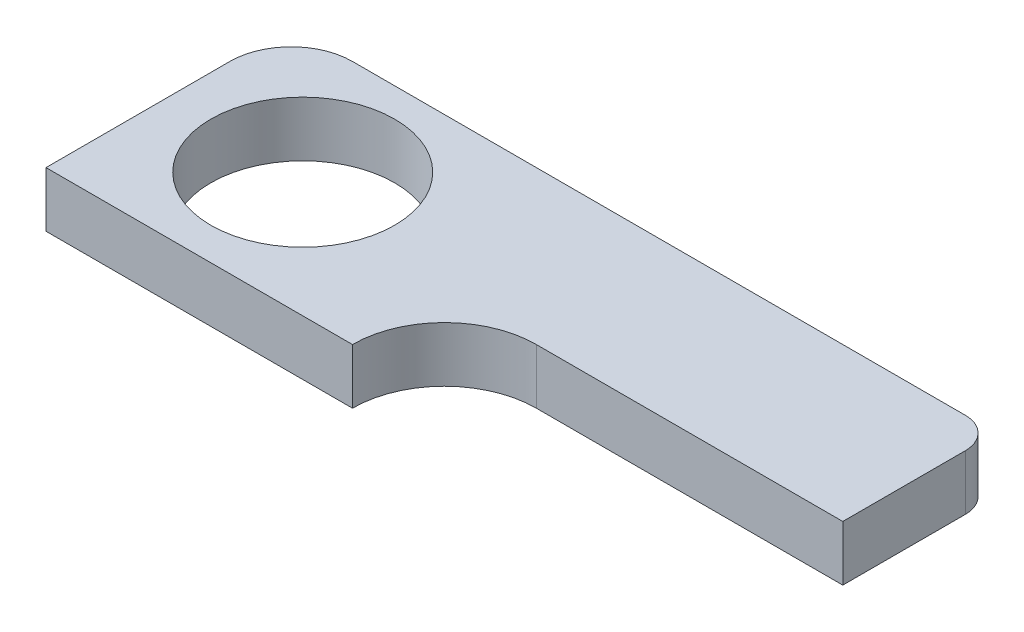
ISO-10303-21;
HEADER;
FILE_DESCRIPTION(('STEP AP214'),'2;1');
FILE_NAME('part.step','',(''),(''),'','','');
FILE_SCHEMA(('AUTOMOTIVE_DESIGN { 1 0 10303 214 1 1 1 1 }'));
ENDSEC;
DATA;
#1=APPLICATION_CONTEXT('core data for automotive mechanical design processes');
#2=APPLICATION_PROTOCOL_DEFINITION('international standard','automotive_design',2000,#1);
#3=PRODUCT_CONTEXT('',#1,'mechanical');
#4=PRODUCT('Part','Part','',(#3));
#5=PRODUCT_RELATED_PRODUCT_CATEGORY('part','',(#4));
#6=PRODUCT_DEFINITION_FORMATION('','',#4);
#7=PRODUCT_DEFINITION_CONTEXT('part definition',#1,'design');
#8=PRODUCT_DEFINITION('design','',#6,#7);
#9=PRODUCT_DEFINITION_SHAPE('','',#8);
#10=(LENGTH_UNIT() NAMED_UNIT(*) SI_UNIT(.MILLI.,.METRE.));
#11=(NAMED_UNIT(*) PLANE_ANGLE_UNIT() SI_UNIT($,.RADIAN.));
#12=(NAMED_UNIT(*) SI_UNIT($,.STERADIAN.) SOLID_ANGLE_UNIT());
#13=UNCERTAINTY_MEASURE_WITH_UNIT(LENGTH_MEASURE(1.E-05),#10,'distance_accuracy_value','');
#14=(GEOMETRIC_REPRESENTATION_CONTEXT(3) GLOBAL_UNCERTAINTY_ASSIGNED_CONTEXT((#13)) GLOBAL_UNIT_ASSIGNED_CONTEXT((#10,
#11,#12)) REPRESENTATION_CONTEXT('',''));
#15=CARTESIAN_POINT('',(0.,0.,0.));
#16=DIRECTION('',(0.,0.,1.));
#17=DIRECTION('',(1.,0.,0.));
#18=AXIS2_PLACEMENT_3D('',#15,#16,#17);
#19=CARTESIAN_POINT('',(230.,18.,-90.));
#20=DIRECTION('',(1.,0.,0.));
#21=DIRECTION('',(0.,0.,-1.));
#22=AXIS2_PLACEMENT_3D('',#19,#20,#21);
#23=PLANE('',#22);
#24=DIRECTION('',(0.,0.,1.));
#25=VECTOR('',#24,1.);
#26=CARTESIAN_POINT('',(230.,0.,-90.));
#27=LINE('',#26,#25);
#28=CARTESIAN_POINT('',(230.,0.,-90.));
#29=VERTEX_POINT('',#28);
#30=CARTESIAN_POINT('',(230.,0.,-50.));
#31=VERTEX_POINT('',#30);
#32=EDGE_CURVE('E130',#29,#31,#27,.T.);
#33=ORIENTED_EDGE('',*,*,#32,.F.);
#34=DIRECTION('',(0.,-1.,0.));
#35=VECTOR('',#34,1.);
#36=CARTESIAN_POINT('',(230.,18.,-90.));
#37=LINE('',#36,#35);
#38=CARTESIAN_POINT('',(230.,18.,-90.));
#39=VERTEX_POINT('',#38);
#40=EDGE_CURVE('E11',#39,#29,#37,.T.);
#41=ORIENTED_EDGE('',*,*,#40,.F.);
#42=DIRECTION('',(0.,0.,1.));
#43=VECTOR('',#42,1.);
#44=CARTESIAN_POINT('',(230.,18.,-90.));
#45=LINE('',#44,#43);
#46=CARTESIAN_POINT('',(230.,18.,-50.));
#47=VERTEX_POINT('',#46);
#48=EDGE_CURVE('E151',#39,#47,#45,.T.);
#49=ORIENTED_EDGE('',*,*,#48,.T.);
#50=DIRECTION('',(0.,-1.,0.));
#51=VECTOR('',#50,1.);
#52=CARTESIAN_POINT('',(230.,18.,-50.));
#53=LINE('',#52,#51);
#54=EDGE_CURVE('E36',#47,#31,#53,.T.);
#55=ORIENTED_EDGE('',*,*,#54,.T.);
#56=EDGE_LOOP('',(#33,#41,#49,#55));
#57=FACE_BOUND('',#56,.T.);
#58=ADVANCED_FACE('F33',(#57),#23,.T.);
#59=CARTESIAN_POINT('',(220.,18.,-90.));
#60=DIRECTION('',(0.,-1.,0.));
#61=DIRECTION('',(0.,0.,-1.));
#62=AXIS2_PLACEMENT_3D('',#59,#60,#61);
#63=CYLINDRICAL_SURFACE('',#62,9.99999999999999);
#64=CARTESIAN_POINT('',(220.,0.,-90.));
#65=DIRECTION('',(0.,-1.,0.));
#66=DIRECTION('',(0.,0.,-1.));
#67=AXIS2_PLACEMENT_3D('',#64,#65,#66);
#68=CIRCLE('',#67,9.99999999999999);
#69=CARTESIAN_POINT('',(220.,0.,-100.));
#70=VERTEX_POINT('',#69);
#71=EDGE_CURVE('E149',#70,#29,#68,.T.);
#72=ORIENTED_EDGE('',*,*,#71,.F.);
#73=DIRECTION('',(0.,-1.,0.));
#74=VECTOR('',#73,1.);
#75=CARTESIAN_POINT('',(220.,18.,-100.));
#76=LINE('',#75,#74);
#77=CARTESIAN_POINT('',(220.,18.,-100.));
#78=VERTEX_POINT('',#77);
#79=EDGE_CURVE('E42',#78,#70,#76,.T.);
#80=ORIENTED_EDGE('',*,*,#79,.F.);
#81=CARTESIAN_POINT('',(220.,18.,-90.));
#82=DIRECTION('',(0.,-1.,0.));
#83=DIRECTION('',(0.,0.,-1.));
#84=AXIS2_PLACEMENT_3D('',#81,#82,#83);
#85=CIRCLE('',#84,9.99999999999999);
#86=EDGE_CURVE('E120',#78,#39,#85,.T.);
#87=ORIENTED_EDGE('',*,*,#86,.T.);
#88=ORIENTED_EDGE('',*,*,#40,.T.);
#89=EDGE_LOOP('',(#72,#80,#87,#88));
#90=FACE_BOUND('',#89,.T.);
#91=ADVANCED_FACE('F163',(#90),#63,.T.);
#92=CARTESIAN_POINT('',(20.,18.,-100.));
#93=DIRECTION('',(0.,0.,-1.));
#94=DIRECTION('',(-1.,0.,0.));
#95=AXIS2_PLACEMENT_3D('',#92,#93,#94);
#96=PLANE('',#95);
#97=DIRECTION('',(1.,0.,0.));
#98=VECTOR('',#97,1.);
#99=CARTESIAN_POINT('',(20.,0.,-100.));
#100=LINE('',#99,#98);
#101=CARTESIAN_POINT('',(20.,0.,-100.));
#102=VERTEX_POINT('',#101);
#103=EDGE_CURVE('E107',#102,#70,#100,.T.);
#104=ORIENTED_EDGE('',*,*,#103,.F.);
#105=DIRECTION('',(0.,-1.,0.));
#106=VECTOR('',#105,1.);
#107=CARTESIAN_POINT('',(20.,18.,-100.));
#108=LINE('',#107,#106);
#109=CARTESIAN_POINT('',(20.,18.,-100.));
#110=VERTEX_POINT('',#109);
#111=EDGE_CURVE('E102',#110,#102,#108,.T.);
#112=ORIENTED_EDGE('',*,*,#111,.F.);
#113=DIRECTION('',(1.,0.,0.));
#114=VECTOR('',#113,1.);
#115=CARTESIAN_POINT('',(20.,18.,-100.));
#116=LINE('',#115,#114);
#117=EDGE_CURVE('E105',#110,#78,#116,.T.);
#118=ORIENTED_EDGE('',*,*,#117,.T.);
#119=ORIENTED_EDGE('',*,*,#79,.T.);
#120=EDGE_LOOP('',(#104,#112,#118,#119));
#121=FACE_BOUND('',#120,.T.);
#122=ADVANCED_FACE('F104',(#121),#96,.T.);
#123=CARTESIAN_POINT('',(20.,18.,-80.));
#124=DIRECTION('',(0.,-1.,0.));
#125=DIRECTION('',(0.,0.,-1.));
#126=AXIS2_PLACEMENT_3D('',#123,#124,#125);
#127=CYLINDRICAL_SURFACE('',#126,20.);
#128=CARTESIAN_POINT('',(20.,0.,-80.));
#129=DIRECTION('',(0.,-1.,0.));
#130=DIRECTION('',(0.,0.,-1.));
#131=AXIS2_PLACEMENT_3D('',#128,#129,#130);
#132=CIRCLE('',#131,20.);
#133=CARTESIAN_POINT('',(0.,0.,-79.9999999999999));
#134=VERTEX_POINT('',#133);
#135=EDGE_CURVE('E146',#134,#102,#132,.T.);
#136=ORIENTED_EDGE('',*,*,#135,.F.);
#137=DIRECTION('',(0.,-1.,0.));
#138=VECTOR('',#137,1.);
#139=CARTESIAN_POINT('',(0.,18.,-79.9999999999999));
#140=LINE('',#139,#138);
#141=CARTESIAN_POINT('',(0.,18.,-79.9999999999999));
#142=VERTEX_POINT('',#141);
#143=EDGE_CURVE('E112',#142,#134,#140,.T.);
#144=ORIENTED_EDGE('',*,*,#143,.F.);
#145=CARTESIAN_POINT('',(20.,18.,-80.));
#146=DIRECTION('',(0.,-1.,0.));
#147=DIRECTION('',(0.,0.,-1.));
#148=AXIS2_PLACEMENT_3D('',#145,#146,#147);
#149=CIRCLE('',#148,20.);
#150=EDGE_CURVE('E118',#142,#110,#149,.T.);
#151=ORIENTED_EDGE('',*,*,#150,.T.);
#152=ORIENTED_EDGE('',*,*,#111,.T.);
#153=EDGE_LOOP('',(#136,#144,#151,#152));
#154=FACE_BOUND('',#153,.T.);
#155=ADVANCED_FACE('F122',(#154),#127,.T.);
#156=CARTESIAN_POINT('',(0.,18.,-20.));
#157=DIRECTION('',(-1.,0.,0.));
#158=DIRECTION('',(0.,0.,1.));
#159=AXIS2_PLACEMENT_3D('',#156,#157,#158);
#160=PLANE('',#159);
#161=DIRECTION('',(0.,0.,-1.));
#162=VECTOR('',#161,1.);
#163=CARTESIAN_POINT('',(0.,0.,-20.));
#164=LINE('',#163,#162);
#165=CARTESIAN_POINT('',(0.,0.,-20.));
#166=VERTEX_POINT('',#165);
#167=EDGE_CURVE('E143',#166,#134,#164,.T.);
#168=ORIENTED_EDGE('',*,*,#167,.F.);
#169=DIRECTION('',(0.,-1.,0.));
#170=VECTOR('',#169,1.);
#171=CARTESIAN_POINT('',(0.,18.,-20.));
#172=LINE('',#171,#170);
#173=CARTESIAN_POINT('',(0.,18.,-20.));
#174=VERTEX_POINT('',#173);
#175=EDGE_CURVE('E155',#174,#166,#172,.T.);
#176=ORIENTED_EDGE('',*,*,#175,.F.);
#177=DIRECTION('',(0.,0.,-1.));
#178=VECTOR('',#177,1.);
#179=CARTESIAN_POINT('',(0.,18.,-20.));
#180=LINE('',#179,#178);
#181=EDGE_CURVE('E123',#174,#142,#180,.T.);
#182=ORIENTED_EDGE('',*,*,#181,.T.);
#183=ORIENTED_EDGE('',*,*,#143,.T.);
#184=EDGE_LOOP('',(#168,#176,#182,#183));
#185=FACE_BOUND('',#184,.T.);
#186=ADVANCED_FACE('F176',(#185),#160,.T.);
#187=CARTESIAN_POINT('',(100.,18.,-19.9999999999998));
#188=DIRECTION('',(0.,0.,1.));
#189=DIRECTION('',(1.,0.,0.));
#190=AXIS2_PLACEMENT_3D('',#187,#188,#189);
#191=PLANE('',#190);
#192=DIRECTION('',(-1.,0.,0.));
#193=VECTOR('',#192,1.);
#194=CARTESIAN_POINT('',(100.,0.,-19.9999999999998));
#195=LINE('',#194,#193);
#196=CARTESIAN_POINT('',(100.,0.,-19.9999999999998));
#197=VERTEX_POINT('',#196);
#198=EDGE_CURVE('E140',#197,#166,#195,.T.);
#199=ORIENTED_EDGE('',*,*,#198,.F.);
#200=DIRECTION('',(0.,-1.,0.));
#201=VECTOR('',#200,1.);
#202=CARTESIAN_POINT('',(100.,18.,-19.9999999999998));
#203=LINE('',#202,#201);
#204=CARTESIAN_POINT('',(100.,18.,-19.9999999999998));
#205=VERTEX_POINT('',#204);
#206=EDGE_CURVE('E157',#205,#197,#203,.T.);
#207=ORIENTED_EDGE('',*,*,#206,.F.);
#208=DIRECTION('',(-1.,0.,0.));
#209=VECTOR('',#208,1.);
#210=CARTESIAN_POINT('',(100.,18.,-19.9999999999998));
#211=LINE('',#210,#209);
#212=EDGE_CURVE('E125',#205,#174,#211,.T.);
#213=ORIENTED_EDGE('',*,*,#212,.T.);
#214=ORIENTED_EDGE('',*,*,#175,.T.);
#215=EDGE_LOOP('',(#199,#207,#213,#214));
#216=FACE_BOUND('',#215,.T.);
#217=ADVANCED_FACE('F179',(#216),#191,.T.);
#218=CARTESIAN_POINT('',(130.,18.,-20.));
#219=DIRECTION('',(0.,-1.,0.));
#220=DIRECTION('',(0.,0.,-1.));
#221=AXIS2_PLACEMENT_3D('',#218,#219,#220);
#222=CYLINDRICAL_SURFACE('',#221,30.);
#223=CARTESIAN_POINT('',(130.,0.,-20.));
#224=DIRECTION('',(0.,1.,0.));
#225=DIRECTION('',(0.,0.,1.));
#226=AXIS2_PLACEMENT_3D('',#223,#224,#225);
#227=CIRCLE('',#226,30.);
#228=CARTESIAN_POINT('',(130.,0.,-50.));
#229=VERTEX_POINT('',#228);
#230=EDGE_CURVE('E137',#229,#197,#227,.T.);
#231=ORIENTED_EDGE('',*,*,#230,.F.);
#232=DIRECTION('',(0.,-1.,0.));
#233=VECTOR('',#232,1.);
#234=CARTESIAN_POINT('',(130.,18.,-50.));
#235=LINE('',#234,#233);
#236=CARTESIAN_POINT('',(130.,18.,-50.));
#237=VERTEX_POINT('',#236);
#238=EDGE_CURVE('E158',#237,#229,#235,.T.);
#239=ORIENTED_EDGE('',*,*,#238,.F.);
#240=CARTESIAN_POINT('',(130.,18.,-20.));
#241=DIRECTION('',(0.,1.,0.));
#242=DIRECTION('',(0.,0.,1.));
#243=AXIS2_PLACEMENT_3D('',#240,#241,#242);
#244=CIRCLE('',#243,30.);
#245=EDGE_CURVE('E214',#237,#205,#244,.T.);
#246=ORIENTED_EDGE('',*,*,#245,.T.);
#247=ORIENTED_EDGE('',*,*,#206,.T.);
#248=EDGE_LOOP('',(#231,#239,#246,#247));
#249=FACE_BOUND('',#248,.T.);
#250=ADVANCED_FACE('F183',(#249),#222,.F.);
#251=CARTESIAN_POINT('',(230.,18.,-50.));
#252=DIRECTION('',(0.,0.,1.));
#253=DIRECTION('',(1.,0.,0.));
#254=AXIS2_PLACEMENT_3D('',#251,#252,#253);
#255=PLANE('',#254);
#256=DIRECTION('',(-1.,0.,0.));
#257=VECTOR('',#256,1.);
#258=CARTESIAN_POINT('',(230.,0.,-50.));
#259=LINE('',#258,#257);
#260=EDGE_CURVE('E133',#31,#229,#259,.T.);
#261=ORIENTED_EDGE('',*,*,#260,.F.);
#262=ORIENTED_EDGE('',*,*,#54,.F.);
#263=DIRECTION('',(-1.,0.,0.));
#264=VECTOR('',#263,1.);
#265=CARTESIAN_POINT('',(230.,18.,-50.));
#266=LINE('',#265,#264);
#267=EDGE_CURVE('E212',#47,#237,#266,.T.);
#268=ORIENTED_EDGE('',*,*,#267,.T.);
#269=ORIENTED_EDGE('',*,*,#238,.T.);
#270=EDGE_LOOP('',(#261,#262,#268,#269));
#271=FACE_BOUND('',#270,.T.);
#272=ADVANCED_FACE('F160',(#271),#255,.T.);
#273=CARTESIAN_POINT('',(130.,18.,-20.));
#274=DIRECTION('',(0.,1.,0.));
#275=DIRECTION('',(0.,0.,1.));
#276=AXIS2_PLACEMENT_3D('',#273,#274,#275);
#277=PLANE('',#276);
#278=CARTESIAN_POINT('',(43.1852937481381,18.,-60.5873975964926));
#279=DIRECTION('',(0.,-1.,0.));
#280=DIRECTION('',(0.,0.,1.));
#281=AXIS2_PLACEMENT_3D('',#278,#279,#280);
#282=CIRCLE('',#281,30.);
#283=CARTESIAN_POINT('',(43.1852937481381,18.,-30.5873975964926));
#284=VERTEX_POINT('',#283);
#285=EDGE_CURVE('E134',#284,#284,#282,.T.);
#286=ORIENTED_EDGE('',*,*,#285,.T.);
#287=EDGE_LOOP('',(#286));
#288=FACE_BOUND('',#287,.T.);
#289=ORIENTED_EDGE('',*,*,#48,.F.);
#290=ORIENTED_EDGE('',*,*,#86,.F.);
#291=ORIENTED_EDGE('',*,*,#117,.F.);
#292=ORIENTED_EDGE('',*,*,#150,.F.);
#293=ORIENTED_EDGE('',*,*,#181,.F.);
#294=ORIENTED_EDGE('',*,*,#212,.F.);
#295=ORIENTED_EDGE('',*,*,#245,.F.);
#296=ORIENTED_EDGE('',*,*,#267,.F.);
#297=EDGE_LOOP('',(#289,#290,#291,#292,#293,#294,#295,#296));
#298=FACE_BOUND('',#297,.T.);
#299=ADVANCED_FACE('F116',(#288,#298),#277,.T.);
#300=CARTESIAN_POINT('',(130.,0.,-20.));
#301=DIRECTION('',(0.,1.,0.));
#302=DIRECTION('',(0.,0.,1.));
#303=AXIS2_PLACEMENT_3D('',#300,#301,#302);
#304=PLANE('',#303);
#305=CARTESIAN_POINT('',(43.1852937481381,0.,-60.5873975964926));
#306=DIRECTION('',(0.,-1.,0.));
#307=DIRECTION('',(0.,0.,1.));
#308=AXIS2_PLACEMENT_3D('',#305,#306,#307);
#309=CIRCLE('',#308,30.);
#310=CARTESIAN_POINT('',(43.1852937481381,0.,-30.5873975964926));
#311=VERTEX_POINT('',#310);
#312=EDGE_CURVE('E207',#311,#311,#309,.T.);
#313=ORIENTED_EDGE('',*,*,#312,.F.);
#314=EDGE_LOOP('',(#313));
#315=FACE_BOUND('',#314,.T.);
#316=ORIENTED_EDGE('',*,*,#32,.T.);
#317=ORIENTED_EDGE('',*,*,#260,.T.);
#318=ORIENTED_EDGE('',*,*,#230,.T.);
#319=ORIENTED_EDGE('',*,*,#198,.T.);
#320=ORIENTED_EDGE('',*,*,#167,.T.);
#321=ORIENTED_EDGE('',*,*,#135,.T.);
#322=ORIENTED_EDGE('',*,*,#103,.T.);
#323=ORIENTED_EDGE('',*,*,#71,.T.);
#324=EDGE_LOOP('',(#316,#317,#318,#319,#320,#321,#322,#323));
#325=FACE_BOUND('',#324,.T.);
#326=ADVANCED_FACE('F162',(#315,#325),#304,.F.);
#327=CARTESIAN_POINT('',(43.1852937481381,18.,-60.5873975964926));
#328=DIRECTION('',(0.,-1.,0.));
#329=DIRECTION('',(0.,0.,-1.));
#330=AXIS2_PLACEMENT_3D('',#327,#328,#329);
#331=CYLINDRICAL_SURFACE('',#330,30.);
#332=ORIENTED_EDGE('',*,*,#285,.F.);
#333=EDGE_LOOP('',(#332));
#334=FACE_BOUND('',#333,.T.);
#335=ORIENTED_EDGE('',*,*,#312,.T.);
#336=EDGE_LOOP('',(#335));
#337=FACE_BOUND('',#336,.T.);
#338=ADVANCED_FACE('F195',(#334,#337),#331,.F.);
#339=CLOSED_SHELL('',(#58,#91,#122,#155,#186,#217,#250,#272,#299,#326,#338));
#340=MANIFOLD_SOLID_BREP('B2',#339);
#341=ADVANCED_BREP_SHAPE_REPRESENTATION('',(#18,#340),#14);
#342=SHAPE_DEFINITION_REPRESENTATION(#9,#341);
ENDSEC;
END-ISO-10303-21;
